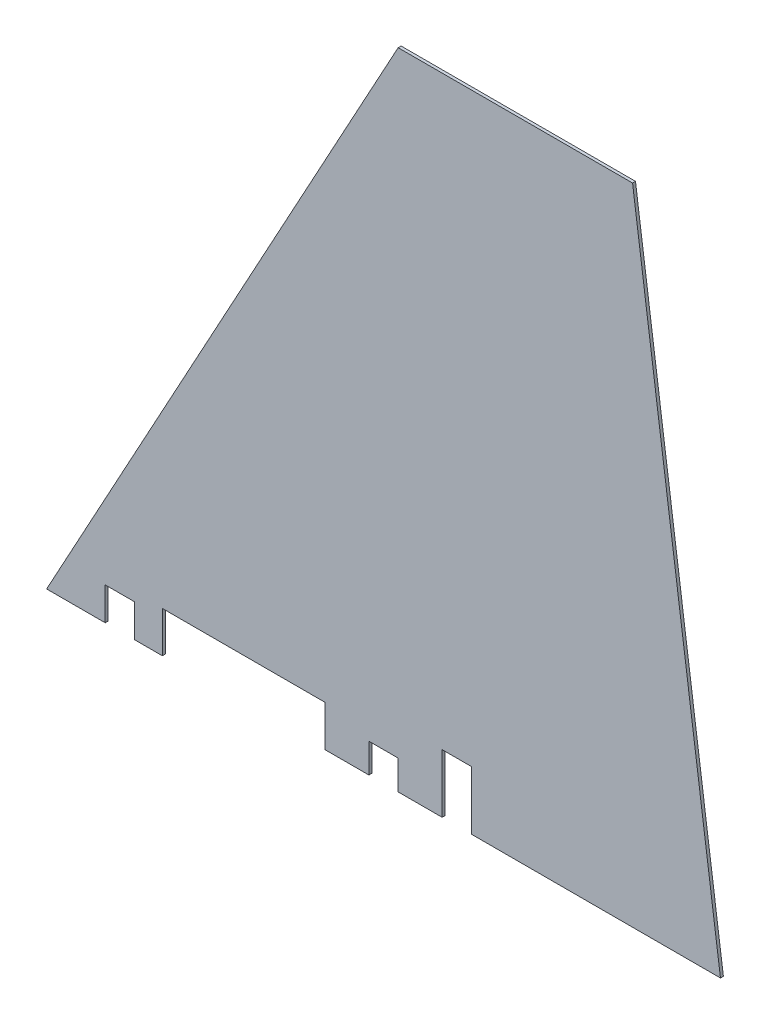
ISO-10303-21;
HEADER;
FILE_DESCRIPTION(('STEP AP214'),'2;1');
FILE_NAME('part.step','',(''),(''),'','','');
FILE_SCHEMA(('AUTOMOTIVE_DESIGN { 1 0 10303 214 1 1 1 1 }'));
ENDSEC;
DATA;
#1=APPLICATION_CONTEXT('core data for automotive mechanical design processes');
#2=APPLICATION_PROTOCOL_DEFINITION('international standard','automotive_design',2000,#1);
#3=PRODUCT_CONTEXT('',#1,'mechanical');
#4=PRODUCT('Part','Part','',(#3));
#5=PRODUCT_RELATED_PRODUCT_CATEGORY('part','',(#4));
#6=PRODUCT_DEFINITION_FORMATION('','',#4);
#7=PRODUCT_DEFINITION_CONTEXT('part definition',#1,'design');
#8=PRODUCT_DEFINITION('design','',#6,#7);
#9=PRODUCT_DEFINITION_SHAPE('','',#8);
#10=(LENGTH_UNIT() NAMED_UNIT(*) SI_UNIT(.MILLI.,.METRE.));
#11=(NAMED_UNIT(*) PLANE_ANGLE_UNIT() SI_UNIT($,.RADIAN.));
#12=(NAMED_UNIT(*) SI_UNIT($,.STERADIAN.) SOLID_ANGLE_UNIT());
#13=UNCERTAINTY_MEASURE_WITH_UNIT(LENGTH_MEASURE(1.E-05),#10,'distance_accuracy_value','');
#14=(GEOMETRIC_REPRESENTATION_CONTEXT(3) GLOBAL_UNCERTAINTY_ASSIGNED_CONTEXT((#13)) GLOBAL_UNIT_ASSIGNED_CONTEXT((#10,
#11,#12)) REPRESENTATION_CONTEXT('',''));
#15=CARTESIAN_POINT('',(0.,0.,0.));
#16=DIRECTION('',(0.,0.,1.));
#17=DIRECTION('',(1.,0.,0.));
#18=AXIS2_PLACEMENT_3D('',#15,#16,#17);
#19=CARTESIAN_POINT('',(-82.2853059546856,44.8828941571012,0.));
#20=DIRECTION('',(-0.877895572914385,0.478852130680573,0.));
#21=DIRECTION('',(-0.478852130680573,-0.877895572914385,0.));
#22=AXIS2_PLACEMENT_3D('',#19,#20,#21);
#23=PLANE('',#22);
#24=DIRECTION('',(0.,0.,-1.));
#25=VECTOR('',#24,1.);
#26=CARTESIAN_POINT('',(-150.323962146502,-79.8546421945616,0.));
#27=LINE('',#26,#25);
#28=CARTESIAN_POINT('',(-150.323962146502,-79.8546421945616,2.54));
#29=VERTEX_POINT('',#28);
#30=CARTESIAN_POINT('',(-150.323962146502,-79.8546421945616,0.));
#31=VERTEX_POINT('',#30);
#32=EDGE_CURVE('E11',#29,#31,#27,.T.);
#33=ORIENTED_EDGE('',*,*,#32,.F.);
#34=DIRECTION('',(-0.478852130680573,-0.877895572914385,0.));
#35=VECTOR('',#34,1.);
#36=CARTESIAN_POINT('',(-82.2853059546856,44.8828941571012,2.54));
#37=LINE('',#36,#35);
#38=CARTESIAN_POINT('',(154.476037853498,478.945357805438,2.54));
#39=VERTEX_POINT('',#38);
#40=EDGE_CURVE('E140',#39,#29,#37,.T.);
#41=ORIENTED_EDGE('',*,*,#40,.F.);
#42=DIRECTION('',(0.,0.,-1.));
#43=VECTOR('',#42,1.);
#44=CARTESIAN_POINT('',(154.476037853498,478.945357805438,0.));
#45=LINE('',#44,#43);
#46=CARTESIAN_POINT('',(154.476037853498,478.945357805438,0.));
#47=VERTEX_POINT('',#46);
#48=EDGE_CURVE('E46',#39,#47,#45,.T.);
#49=ORIENTED_EDGE('',*,*,#48,.T.);
#50=DIRECTION('',(-0.478852130680573,-0.877895572914385,0.));
#51=VECTOR('',#50,1.);
#52=CARTESIAN_POINT('',(-82.2853059546856,44.8828941571012,0.));
#53=LINE('',#52,#51);
#54=EDGE_CURVE('E251',#47,#31,#53,.T.);
#55=ORIENTED_EDGE('',*,*,#54,.T.);
#56=EDGE_LOOP('',(#33,#41,#49,#55));
#57=FACE_BOUND('',#56,.T.);
#58=ADVANCED_FACE('F37',(#57),#23,.T.);
#59=CARTESIAN_POINT('',(0.,478.945357805438,0.));
#60=DIRECTION('',(0.,-1.,0.));
#61=DIRECTION('',(1.,0.,0.));
#62=AXIS2_PLACEMENT_3D('',#59,#60,#61);
#63=PLANE('',#62);
#64=ORIENTED_EDGE('',*,*,#48,.F.);
#65=DIRECTION('',(1.,0.,0.));
#66=VECTOR('',#65,1.);
#67=CARTESIAN_POINT('',(0.,478.945357805438,2.54));
#68=LINE('',#67,#66);
#69=CARTESIAN_POINT('',(357.676037853498,478.945357805438,2.54));
#70=VERTEX_POINT('',#69);
#71=EDGE_CURVE('E195',#39,#70,#68,.T.);
#72=ORIENTED_EDGE('',*,*,#71,.T.);
#73=DIRECTION('',(0.,0.,-1.));
#74=VECTOR('',#73,1.);
#75=CARTESIAN_POINT('',(357.676037853498,478.945357805438,0.));
#76=LINE('',#75,#74);
#77=CARTESIAN_POINT('',(357.676037853498,478.945357805438,0.));
#78=VERTEX_POINT('',#77);
#79=EDGE_CURVE('E244',#70,#78,#76,.T.);
#80=ORIENTED_EDGE('',*,*,#79,.T.);
#81=DIRECTION('',(1.,0.,0.));
#82=VECTOR('',#81,1.);
#83=CARTESIAN_POINT('',(0.,478.945357805438,0.));
#84=LINE('',#83,#82);
#85=EDGE_CURVE('E260',#47,#78,#84,.T.);
#86=ORIENTED_EDGE('',*,*,#85,.F.);
#87=EDGE_LOOP('',(#64,#72,#80,#86));
#88=FACE_BOUND('',#87,.T.);
#89=ADVANCED_FACE('F263',(#88),#63,.F.);
#90=CARTESIAN_POINT('',(415.264900479213,56.6270318835292,0.));
#91=DIRECTION('',(-0.990830168044299,-0.135113204733314,0.));
#92=DIRECTION('',(0.135113204733314,-0.990830168044299,0.));
#93=AXIS2_PLACEMENT_3D('',#90,#91,#92);
#94=PLANE('',#93);
#95=ORIENTED_EDGE('',*,*,#79,.F.);
#96=DIRECTION('',(0.135113204733314,-0.990830168044299,0.));
#97=VECTOR('',#96,1.);
#98=CARTESIAN_POINT('',(415.264900479213,56.6270318835292,2.54));
#99=LINE('',#98,#97);
#100=CARTESIAN_POINT('',(433.876037853498,-79.8546421945616,2.54));
#101=VERTEX_POINT('',#100);
#102=EDGE_CURVE('E192',#70,#101,#99,.T.);
#103=ORIENTED_EDGE('',*,*,#102,.T.);
#104=DIRECTION('',(0.,0.,-1.));
#105=VECTOR('',#104,1.);
#106=CARTESIAN_POINT('',(433.876037853498,-79.8546421945616,0.));
#107=LINE('',#106,#105);
#108=CARTESIAN_POINT('',(433.876037853498,-79.8546421945616,0.));
#109=VERTEX_POINT('',#108);
#110=EDGE_CURVE('E241',#101,#109,#107,.T.);
#111=ORIENTED_EDGE('',*,*,#110,.T.);
#112=DIRECTION('',(0.135113204733314,-0.990830168044299,0.));
#113=VECTOR('',#112,1.);
#114=CARTESIAN_POINT('',(415.264900479213,56.6270318835292,0.));
#115=LINE('',#114,#113);
#116=EDGE_CURVE('E264',#78,#109,#115,.T.);
#117=ORIENTED_EDGE('',*,*,#116,.F.);
#118=EDGE_LOOP('',(#95,#103,#111,#117));
#119=FACE_BOUND('',#118,.T.);
#120=ADVANCED_FACE('F380',(#119),#94,.F.);
#121=CARTESIAN_POINT('',(0.,-79.8546421945616,0.));
#122=DIRECTION('',(0.,-1.,0.));
#123=DIRECTION('',(1.,0.,0.));
#124=AXIS2_PLACEMENT_3D('',#121,#122,#123);
#125=PLANE('',#124);
#126=ORIENTED_EDGE('',*,*,#110,.F.);
#127=DIRECTION('',(1.,0.,0.));
#128=VECTOR('',#127,1.);
#129=CARTESIAN_POINT('',(0.,-79.8546421945616,2.54));
#130=LINE('',#129,#128);
#131=CARTESIAN_POINT('',(217.976037853498,-79.8546421945616,2.54));
#132=VERTEX_POINT('',#131);
#133=EDGE_CURVE('E189',#132,#101,#130,.T.);
#134=ORIENTED_EDGE('',*,*,#133,.F.);
#135=DIRECTION('',(0.,0.,-1.));
#136=VECTOR('',#135,1.);
#137=CARTESIAN_POINT('',(217.976037853498,-79.8546421945616,0.));
#138=LINE('',#137,#136);
#139=CARTESIAN_POINT('',(217.976037853498,-79.8546421945616,0.));
#140=VERTEX_POINT('',#139);
#141=EDGE_CURVE('E238',#132,#140,#138,.T.);
#142=ORIENTED_EDGE('',*,*,#141,.T.);
#143=DIRECTION('',(1.,0.,0.));
#144=VECTOR('',#143,1.);
#145=CARTESIAN_POINT('',(0.,-79.8546421945616,0.));
#146=LINE('',#145,#144);
#147=EDGE_CURVE('E266',#140,#109,#146,.T.);
#148=ORIENTED_EDGE('',*,*,#147,.T.);
#149=EDGE_LOOP('',(#126,#134,#142,#148));
#150=FACE_BOUND('',#149,.T.);
#151=ADVANCED_FACE('F401',(#150),#125,.T.);
#152=CARTESIAN_POINT('',(217.976037853498,0.,0.));
#153=DIRECTION('',(1.,0.,0.));
#154=DIRECTION('',(0.,1.,0.));
#155=AXIS2_PLACEMENT_3D('',#152,#153,#154);
#156=PLANE('',#155);
#157=ORIENTED_EDGE('',*,*,#141,.F.);
#158=DIRECTION('',(0.,1.,0.));
#159=VECTOR('',#158,1.);
#160=CARTESIAN_POINT('',(217.976037853498,0.,2.54));
#161=LINE('',#160,#159);
#162=CARTESIAN_POINT('',(217.976037853498,-29.0546421945615,2.54));
#163=VERTEX_POINT('',#162);
#164=EDGE_CURVE('E186',#132,#163,#161,.T.);
#165=ORIENTED_EDGE('',*,*,#164,.T.);
#166=DIRECTION('',(0.,0.,-1.));
#167=VECTOR('',#166,1.);
#168=CARTESIAN_POINT('',(217.976037853498,-29.0546421945615,0.));
#169=LINE('',#168,#167);
#170=CARTESIAN_POINT('',(217.976037853498,-29.0546421945615,0.));
#171=VERTEX_POINT('',#170);
#172=EDGE_CURVE('E235',#163,#171,#169,.T.);
#173=ORIENTED_EDGE('',*,*,#172,.T.);
#174=DIRECTION('',(0.,1.,0.));
#175=VECTOR('',#174,1.);
#176=CARTESIAN_POINT('',(217.976037853498,0.,0.));
#177=LINE('',#176,#175);
#178=EDGE_CURVE('E270',#140,#171,#177,.T.);
#179=ORIENTED_EDGE('',*,*,#178,.F.);
#180=EDGE_LOOP('',(#157,#165,#173,#179));
#181=FACE_BOUND('',#180,.T.);
#182=ADVANCED_FACE('F386',(#181),#156,.F.);
#183=CARTESIAN_POINT('',(0.,-29.0546421945615,0.));
#184=DIRECTION('',(0.,1.,0.));
#185=DIRECTION('',(-1.,0.,0.));
#186=AXIS2_PLACEMENT_3D('',#183,#184,#185);
#187=PLANE('',#186);
#188=ORIENTED_EDGE('',*,*,#172,.F.);
#189=DIRECTION('',(1.,0.,0.));
#190=VECTOR('',#189,1.);
#191=CARTESIAN_POINT('',(0.,-29.0546421945615,2.54));
#192=LINE('',#191,#190);
#193=CARTESIAN_POINT('',(192.576037853498,-29.0546421945615,2.54));
#194=VERTEX_POINT('',#193);
#195=EDGE_CURVE('E183',#163,#194,#192,.F.);
#196=ORIENTED_EDGE('',*,*,#195,.T.);
#197=DIRECTION('',(0.,0.,-1.));
#198=VECTOR('',#197,1.);
#199=CARTESIAN_POINT('',(192.576037853498,-29.0546421945615,0.));
#200=LINE('',#199,#198);
#201=CARTESIAN_POINT('',(192.576037853498,-29.0546421945615,0.));
#202=VERTEX_POINT('',#201);
#203=EDGE_CURVE('E232',#194,#202,#200,.T.);
#204=ORIENTED_EDGE('',*,*,#203,.T.);
#205=DIRECTION('',(-1.,0.,0.));
#206=VECTOR('',#205,1.);
#207=CARTESIAN_POINT('',(0.,-29.0546421945615,0.));
#208=LINE('',#207,#206);
#209=EDGE_CURVE('E273',#171,#202,#208,.T.);
#210=ORIENTED_EDGE('',*,*,#209,.F.);
#211=EDGE_LOOP('',(#188,#196,#204,#210));
#212=FACE_BOUND('',#211,.T.);
#213=ADVANCED_FACE('F390',(#212),#187,.F.);
#214=CARTESIAN_POINT('',(192.576037853498,-1.05217692527578E-13,0.));
#215=DIRECTION('',(-1.,0.,0.));
#216=DIRECTION('',(0.,-1.,0.));
#217=AXIS2_PLACEMENT_3D('',#214,#215,#216);
#218=PLANE('',#217);
#219=ORIENTED_EDGE('',*,*,#203,.F.);
#220=DIRECTION('',(0.,1.,0.));
#221=VECTOR('',#220,1.);
#222=CARTESIAN_POINT('',(192.576037853498,0.,2.54));
#223=LINE('',#222,#221);
#224=CARTESIAN_POINT('',(192.576037853498,-79.8546421945616,2.54));
#225=VERTEX_POINT('',#224);
#226=EDGE_CURVE('E180',#194,#225,#223,.F.);
#227=ORIENTED_EDGE('',*,*,#226,.T.);
#228=DIRECTION('',(0.,0.,-1.));
#229=VECTOR('',#228,1.);
#230=CARTESIAN_POINT('',(192.576037853498,-79.8546421945616,0.));
#231=LINE('',#230,#229);
#232=CARTESIAN_POINT('',(192.576037853498,-79.8546421945616,0.));
#233=VERTEX_POINT('',#232);
#234=EDGE_CURVE('E229',#225,#233,#231,.T.);
#235=ORIENTED_EDGE('',*,*,#234,.T.);
#236=DIRECTION('',(0.,-1.,0.));
#237=VECTOR('',#236,1.);
#238=CARTESIAN_POINT('',(192.576037853498,-1.05217692527578E-13,0.));
#239=LINE('',#238,#237);
#240=EDGE_CURVE('E276',#202,#233,#239,.T.);
#241=ORIENTED_EDGE('',*,*,#240,.F.);
#242=EDGE_LOOP('',(#219,#227,#235,#241));
#243=FACE_BOUND('',#242,.T.);
#244=ADVANCED_FACE('F393',(#243),#218,.F.);
#245=ORIENTED_EDGE('',*,*,#234,.F.);
#246=DIRECTION('',(1.,0.,0.));
#247=VECTOR('',#246,1.);
#248=CARTESIAN_POINT('',(0.,-79.8546421945616,2.54));
#249=LINE('',#248,#247);
#250=CARTESIAN_POINT('',(154.476037853498,-79.8546421945616,2.54));
#251=VERTEX_POINT('',#250);
#252=EDGE_CURVE('E177',#251,#225,#249,.T.);
#253=ORIENTED_EDGE('',*,*,#252,.F.);
#254=DIRECTION('',(0.,0.,-1.));
#255=VECTOR('',#254,1.);
#256=CARTESIAN_POINT('',(154.476037853498,-79.8546421945616,0.));
#257=LINE('',#256,#255);
#258=CARTESIAN_POINT('',(154.476037853498,-79.8546421945616,0.));
#259=VERTEX_POINT('',#258);
#260=EDGE_CURVE('E226',#251,#259,#257,.T.);
#261=ORIENTED_EDGE('',*,*,#260,.T.);
#262=EDGE_CURVE('E279',#259,#233,#146,.T.);
#263=ORIENTED_EDGE('',*,*,#262,.T.);
#264=EDGE_LOOP('',(#245,#253,#261,#263));
#265=FACE_BOUND('',#264,.T.);
#266=ADVANCED_FACE('F317',(#265),#125,.T.);
#267=CARTESIAN_POINT('',(154.476037853498,0.,0.));
#268=DIRECTION('',(1.,0.,0.));
#269=DIRECTION('',(0.,1.,0.));
#270=AXIS2_PLACEMENT_3D('',#267,#268,#269);
#271=PLANE('',#270);
#272=ORIENTED_EDGE('',*,*,#260,.F.);
#273=DIRECTION('',(0.,1.,0.));
#274=VECTOR('',#273,1.);
#275=CARTESIAN_POINT('',(154.476037853498,0.,2.54));
#276=LINE('',#275,#274);
#277=CARTESIAN_POINT('',(154.476037853498,-54.4546421945616,2.54));
#278=VERTEX_POINT('',#277);
#279=EDGE_CURVE('E174',#251,#278,#276,.T.);
#280=ORIENTED_EDGE('',*,*,#279,.T.);
#281=DIRECTION('',(0.,0.,-1.));
#282=VECTOR('',#281,1.);
#283=CARTESIAN_POINT('',(154.476037853498,-54.4546421945616,0.));
#284=LINE('',#283,#282);
#285=CARTESIAN_POINT('',(154.476037853498,-54.4546421945616,0.));
#286=VERTEX_POINT('',#285);
#287=EDGE_CURVE('E223',#278,#286,#284,.T.);
#288=ORIENTED_EDGE('',*,*,#287,.T.);
#289=DIRECTION('',(0.,1.,0.));
#290=VECTOR('',#289,1.);
#291=CARTESIAN_POINT('',(154.476037853498,0.,0.));
#292=LINE('',#291,#290);
#293=EDGE_CURVE('E280',#259,#286,#292,.T.);
#294=ORIENTED_EDGE('',*,*,#293,.F.);
#295=EDGE_LOOP('',(#272,#280,#288,#294));
#296=FACE_BOUND('',#295,.T.);
#297=ADVANCED_FACE('F328',(#296),#271,.F.);
#298=CARTESIAN_POINT('',(0.,-54.4546421945616,0.));
#299=DIRECTION('',(0.,1.,0.));
#300=DIRECTION('',(-1.,0.,0.));
#301=AXIS2_PLACEMENT_3D('',#298,#299,#300);
#302=PLANE('',#301);
#303=ORIENTED_EDGE('',*,*,#287,.F.);
#304=DIRECTION('',(1.,0.,0.));
#305=VECTOR('',#304,1.);
#306=CARTESIAN_POINT('',(0.,-54.4546421945616,2.54));
#307=LINE('',#306,#305);
#308=CARTESIAN_POINT('',(129.076037853498,-54.4546421945616,2.54));
#309=VERTEX_POINT('',#308);
#310=EDGE_CURVE('E171',#278,#309,#307,.F.);
#311=ORIENTED_EDGE('',*,*,#310,.T.);
#312=DIRECTION('',(0.,0.,-1.));
#313=VECTOR('',#312,1.);
#314=CARTESIAN_POINT('',(129.076037853498,-54.4546421945616,0.));
#315=LINE('',#314,#313);
#316=CARTESIAN_POINT('',(129.076037853498,-54.4546421945616,0.));
#317=VERTEX_POINT('',#316);
#318=EDGE_CURVE('E220',#309,#317,#315,.T.);
#319=ORIENTED_EDGE('',*,*,#318,.T.);
#320=DIRECTION('',(-1.,0.,0.));
#321=VECTOR('',#320,1.);
#322=CARTESIAN_POINT('',(0.,-54.4546421945616,0.));
#323=LINE('',#322,#321);
#324=EDGE_CURVE('E283',#286,#317,#323,.T.);
#325=ORIENTED_EDGE('',*,*,#324,.F.);
#326=EDGE_LOOP('',(#303,#311,#319,#325));
#327=FACE_BOUND('',#326,.T.);
#328=ADVANCED_FACE('F334',(#327),#302,.F.);
#329=CARTESIAN_POINT('',(129.076037853498,1.41046446016084E-13,0.));
#330=DIRECTION('',(-1.,0.,0.));
#331=DIRECTION('',(0.,-1.,0.));
#332=AXIS2_PLACEMENT_3D('',#329,#330,#331);
#333=PLANE('',#332);
#334=ORIENTED_EDGE('',*,*,#318,.F.);
#335=DIRECTION('',(0.,1.,0.));
#336=VECTOR('',#335,1.);
#337=CARTESIAN_POINT('',(129.076037853498,0.,2.54));
#338=LINE('',#337,#336);
#339=CARTESIAN_POINT('',(129.076037853498,-79.8546421945616,2.54));
#340=VERTEX_POINT('',#339);
#341=EDGE_CURVE('E168',#309,#340,#338,.F.);
#342=ORIENTED_EDGE('',*,*,#341,.T.);
#343=DIRECTION('',(0.,0.,-1.));
#344=VECTOR('',#343,1.);
#345=CARTESIAN_POINT('',(129.076037853498,-79.8546421945616,0.));
#346=LINE('',#345,#344);
#347=CARTESIAN_POINT('',(129.076037853498,-79.8546421945616,0.));
#348=VERTEX_POINT('',#347);
#349=EDGE_CURVE('E217',#340,#348,#346,.T.);
#350=ORIENTED_EDGE('',*,*,#349,.T.);
#351=DIRECTION('',(0.,-1.,0.));
#352=VECTOR('',#351,1.);
#353=CARTESIAN_POINT('',(129.076037853498,1.41046446016084E-13,0.));
#354=LINE('',#353,#352);
#355=EDGE_CURVE('E286',#317,#348,#354,.T.);
#356=ORIENTED_EDGE('',*,*,#355,.F.);
#357=EDGE_LOOP('',(#334,#342,#350,#356));
#358=FACE_BOUND('',#357,.T.);
#359=ADVANCED_FACE('F339',(#358),#333,.F.);
#360=ORIENTED_EDGE('',*,*,#349,.F.);
#361=DIRECTION('',(1.,0.,0.));
#362=VECTOR('',#361,1.);
#363=CARTESIAN_POINT('',(0.,-79.8546421945616,2.54));
#364=LINE('',#363,#362);
#365=CARTESIAN_POINT('',(90.9760378534982,-79.8546421945616,2.54));
#366=VERTEX_POINT('',#365);
#367=EDGE_CURVE('E165',#366,#340,#364,.T.);
#368=ORIENTED_EDGE('',*,*,#367,.F.);
#369=DIRECTION('',(0.,0.,-1.));
#370=VECTOR('',#369,1.);
#371=CARTESIAN_POINT('',(90.9760378534982,-79.8546421945616,0.));
#372=LINE('',#371,#370);
#373=CARTESIAN_POINT('',(90.9760378534982,-79.8546421945616,0.));
#374=VERTEX_POINT('',#373);
#375=EDGE_CURVE('E214',#366,#374,#372,.T.);
#376=ORIENTED_EDGE('',*,*,#375,.T.);
#377=EDGE_CURVE('E289',#374,#348,#146,.T.);
#378=ORIENTED_EDGE('',*,*,#377,.T.);
#379=EDGE_LOOP('',(#360,#368,#376,#378));
#380=FACE_BOUND('',#379,.T.);
#381=ADVANCED_FACE('F348',(#380),#125,.T.);
#382=CARTESIAN_POINT('',(90.9760378534982,0.,0.));
#383=DIRECTION('',(1.,0.,0.));
#384=DIRECTION('',(0.,1.,0.));
#385=AXIS2_PLACEMENT_3D('',#382,#383,#384);
#386=PLANE('',#385);
#387=ORIENTED_EDGE('',*,*,#375,.F.);
#388=DIRECTION('',(0.,1.,0.));
#389=VECTOR('',#388,1.);
#390=CARTESIAN_POINT('',(90.9760378534982,0.,2.54));
#391=LINE('',#390,#389);
#392=CARTESIAN_POINT('',(90.9760378534982,-44.2946421945616,2.54));
#393=VERTEX_POINT('',#392);
#394=EDGE_CURVE('E162',#366,#393,#391,.T.);
#395=ORIENTED_EDGE('',*,*,#394,.T.);
#396=DIRECTION('',(0.,0.,-1.));
#397=VECTOR('',#396,1.);
#398=CARTESIAN_POINT('',(90.9760378534982,-44.2946421945616,0.));
#399=LINE('',#398,#397);
#400=CARTESIAN_POINT('',(90.9760378534982,-44.2946421945616,0.));
#401=VERTEX_POINT('',#400);
#402=EDGE_CURVE('E211',#393,#401,#399,.T.);
#403=ORIENTED_EDGE('',*,*,#402,.T.);
#404=DIRECTION('',(0.,1.,0.));
#405=VECTOR('',#404,1.);
#406=CARTESIAN_POINT('',(90.9760378534982,0.,0.));
#407=LINE('',#406,#405);
#408=EDGE_CURVE('E290',#374,#401,#407,.T.);
#409=ORIENTED_EDGE('',*,*,#408,.F.);
#410=EDGE_LOOP('',(#387,#395,#403,#409));
#411=FACE_BOUND('',#410,.T.);
#412=ADVANCED_FACE('F352',(#411),#386,.F.);
#413=CARTESIAN_POINT('',(0.,-44.2946421945616,0.));
#414=DIRECTION('',(0.,1.,0.));
#415=DIRECTION('',(-1.,0.,0.));
#416=AXIS2_PLACEMENT_3D('',#413,#414,#415);
#417=PLANE('',#416);
#418=ORIENTED_EDGE('',*,*,#402,.F.);
#419=DIRECTION('',(1.,0.,0.));
#420=VECTOR('',#419,1.);
#421=CARTESIAN_POINT('',(0.,-44.2946421945616,2.54));
#422=LINE('',#421,#420);
#423=CARTESIAN_POINT('',(-49.9939621465018,-44.2946421945616,2.54));
#424=VERTEX_POINT('',#423);
#425=EDGE_CURVE('E159',#393,#424,#422,.F.);
#426=ORIENTED_EDGE('',*,*,#425,.T.);
#427=DIRECTION('',(0.,0.,-1.));
#428=VECTOR('',#427,1.);
#429=CARTESIAN_POINT('',(-49.9939621465018,-44.2946421945616,0.));
#430=LINE('',#429,#428);
#431=CARTESIAN_POINT('',(-49.9939621465018,-44.2946421945616,0.));
#432=VERTEX_POINT('',#431);
#433=EDGE_CURVE('E208',#424,#432,#430,.T.);
#434=ORIENTED_EDGE('',*,*,#433,.T.);
#435=DIRECTION('',(-1.,0.,0.));
#436=VECTOR('',#435,1.);
#437=CARTESIAN_POINT('',(0.,-44.2946421945616,0.));
#438=LINE('',#437,#436);
#439=EDGE_CURVE('E293',#401,#432,#438,.T.);
#440=ORIENTED_EDGE('',*,*,#439,.F.);
#441=EDGE_LOOP('',(#418,#426,#434,#440));
#442=FACE_BOUND('',#441,.T.);
#443=ADVANCED_FACE('F356',(#442),#417,.F.);
#444=CARTESIAN_POINT('',(-49.9939621465018,0.,0.));
#445=DIRECTION('',(-1.,0.,0.));
#446=DIRECTION('',(0.,-1.,0.));
#447=AXIS2_PLACEMENT_3D('',#444,#445,#446);
#448=PLANE('',#447);
#449=ORIENTED_EDGE('',*,*,#433,.F.);
#450=DIRECTION('',(0.,1.,0.));
#451=VECTOR('',#450,1.);
#452=CARTESIAN_POINT('',(-49.9939621465018,0.,2.54));
#453=LINE('',#452,#451);
#454=CARTESIAN_POINT('',(-49.9939621465018,-79.8546421945616,2.54));
#455=VERTEX_POINT('',#454);
#456=EDGE_CURVE('E156',#424,#455,#453,.F.);
#457=ORIENTED_EDGE('',*,*,#456,.T.);
#458=DIRECTION('',(0.,0.,-1.));
#459=VECTOR('',#458,1.);
#460=CARTESIAN_POINT('',(-49.9939621465018,-79.8546421945616,0.));
#461=LINE('',#460,#459);
#462=CARTESIAN_POINT('',(-49.9939621465018,-79.8546421945616,0.));
#463=VERTEX_POINT('',#462);
#464=EDGE_CURVE('E205',#455,#463,#461,.T.);
#465=ORIENTED_EDGE('',*,*,#464,.T.);
#466=DIRECTION('',(0.,-1.,0.));
#467=VECTOR('',#466,1.);
#468=CARTESIAN_POINT('',(-49.9939621465018,0.,0.));
#469=LINE('',#468,#467);
#470=EDGE_CURVE('E296',#432,#463,#469,.T.);
#471=ORIENTED_EDGE('',*,*,#470,.F.);
#472=EDGE_LOOP('',(#449,#457,#465,#471));
#473=FACE_BOUND('',#472,.T.);
#474=ADVANCED_FACE('F363',(#473),#448,.F.);
#475=ORIENTED_EDGE('',*,*,#464,.F.);
#476=DIRECTION('',(1.,0.,0.));
#477=VECTOR('',#476,1.);
#478=CARTESIAN_POINT('',(0.,-79.8546421945616,2.54));
#479=LINE('',#478,#477);
#480=CARTESIAN_POINT('',(-74.1239621465018,-79.8546421945616,2.54));
#481=VERTEX_POINT('',#480);
#482=EDGE_CURVE('E153',#481,#455,#479,.T.);
#483=ORIENTED_EDGE('',*,*,#482,.F.);
#484=DIRECTION('',(0.,0.,-1.));
#485=VECTOR('',#484,1.);
#486=CARTESIAN_POINT('',(-74.1239621465018,-79.8546421945616,0.));
#487=LINE('',#486,#485);
#488=CARTESIAN_POINT('',(-74.1239621465018,-79.8546421945616,0.));
#489=VERTEX_POINT('',#488);
#490=EDGE_CURVE('E202',#481,#489,#487,.T.);
#491=ORIENTED_EDGE('',*,*,#490,.T.);
#492=EDGE_CURVE('E298',#489,#463,#146,.T.);
#493=ORIENTED_EDGE('',*,*,#492,.T.);
#494=EDGE_LOOP('',(#475,#483,#491,#493));
#495=FACE_BOUND('',#494,.T.);
#496=ADVANCED_FACE('F366',(#495),#125,.T.);
#497=CARTESIAN_POINT('',(-74.1239621465018,0.,0.));
#498=DIRECTION('',(1.,0.,0.));
#499=DIRECTION('',(0.,1.,0.));
#500=AXIS2_PLACEMENT_3D('',#497,#498,#499);
#501=PLANE('',#500);
#502=ORIENTED_EDGE('',*,*,#490,.F.);
#503=DIRECTION('',(0.,1.,0.));
#504=VECTOR('',#503,1.);
#505=CARTESIAN_POINT('',(-74.1239621465018,0.,2.54));
#506=LINE('',#505,#504);
#507=CARTESIAN_POINT('',(-74.1239621465018,-51.3791530944628,2.54));
#508=VERTEX_POINT('',#507);
#509=EDGE_CURVE('E150',#481,#508,#506,.T.);
#510=ORIENTED_EDGE('',*,*,#509,.T.);
#511=DIRECTION('',(0.,0.,-1.));
#512=VECTOR('',#511,1.);
#513=CARTESIAN_POINT('',(-74.1239621465018,-51.3791530944628,0.));
#514=LINE('',#513,#512);
#515=CARTESIAN_POINT('',(-74.1239621465018,-51.3791530944628,0.));
#516=VERTEX_POINT('',#515);
#517=EDGE_CURVE('E200',#508,#516,#514,.T.);
#518=ORIENTED_EDGE('',*,*,#517,.T.);
#519=DIRECTION('',(0.,1.,0.));
#520=VECTOR('',#519,1.);
#521=CARTESIAN_POINT('',(-74.1239621465018,0.,0.));
#522=LINE('',#521,#520);
#523=EDGE_CURVE('E299',#489,#516,#522,.T.);
#524=ORIENTED_EDGE('',*,*,#523,.F.);
#525=EDGE_LOOP('',(#502,#510,#518,#524));
#526=FACE_BOUND('',#525,.T.);
#527=ADVANCED_FACE('F369',(#526),#501,.F.);
#528=CARTESIAN_POINT('',(0.,-51.3791530944628,0.));
#529=DIRECTION('',(0.,1.,0.));
#530=DIRECTION('',(-1.,0.,0.));
#531=AXIS2_PLACEMENT_3D('',#528,#529,#530);
#532=PLANE('',#531);
#533=ORIENTED_EDGE('',*,*,#517,.F.);
#534=DIRECTION('',(1.,0.,0.));
#535=VECTOR('',#534,1.);
#536=CARTESIAN_POINT('',(0.,-51.3791530944628,2.54));
#537=LINE('',#536,#535);
#538=CARTESIAN_POINT('',(-99.5239621465018,-51.3791530944627,2.54));
#539=VERTEX_POINT('',#538);
#540=EDGE_CURVE('E147',#508,#539,#537,.F.);
#541=ORIENTED_EDGE('',*,*,#540,.T.);
#542=DIRECTION('',(0.,0.,-1.));
#543=VECTOR('',#542,1.);
#544=CARTESIAN_POINT('',(-99.5239621465018,-51.3791530944627,0.));
#545=LINE('',#544,#543);
#546=CARTESIAN_POINT('',(-99.5239621465018,-51.3791530944627,0.));
#547=VERTEX_POINT('',#546);
#548=EDGE_CURVE('E54',#539,#547,#545,.T.);
#549=ORIENTED_EDGE('',*,*,#548,.T.);
#550=DIRECTION('',(-1.,0.,0.));
#551=VECTOR('',#550,1.);
#552=CARTESIAN_POINT('',(0.,-51.3791530944628,0.));
#553=LINE('',#552,#551);
#554=EDGE_CURVE('E133',#516,#547,#553,.T.);
#555=ORIENTED_EDGE('',*,*,#554,.F.);
#556=EDGE_LOOP('',(#533,#541,#549,#555));
#557=FACE_BOUND('',#556,.T.);
#558=ADVANCED_FACE('F428',(#557),#532,.F.);
#559=CARTESIAN_POINT('',(-99.5239621465018,0.,0.));
#560=DIRECTION('',(-1.,0.,0.));
#561=DIRECTION('',(0.,-1.,0.));
#562=AXIS2_PLACEMENT_3D('',#559,#560,#561);
#563=PLANE('',#562);
#564=ORIENTED_EDGE('',*,*,#548,.F.);
#565=DIRECTION('',(0.,1.,0.));
#566=VECTOR('',#565,1.);
#567=CARTESIAN_POINT('',(-99.5239621465018,0.,2.54));
#568=LINE('',#567,#566);
#569=CARTESIAN_POINT('',(-99.5239621465018,-79.8546421945616,2.54));
#570=VERTEX_POINT('',#569);
#571=EDGE_CURVE('E138',#539,#570,#568,.F.);
#572=ORIENTED_EDGE('',*,*,#571,.T.);
#573=DIRECTION('',(0.,0.,-1.));
#574=VECTOR('',#573,1.);
#575=CARTESIAN_POINT('',(-99.5239621465018,-79.8546421945616,0.));
#576=LINE('',#575,#574);
#577=CARTESIAN_POINT('',(-99.5239621465018,-79.8546421945616,0.));
#578=VERTEX_POINT('',#577);
#579=EDGE_CURVE('E40',#570,#578,#576,.T.);
#580=ORIENTED_EDGE('',*,*,#579,.T.);
#581=DIRECTION('',(0.,-1.,0.));
#582=VECTOR('',#581,1.);
#583=CARTESIAN_POINT('',(-99.5239621465018,0.,0.));
#584=LINE('',#583,#582);
#585=EDGE_CURVE('E149',#547,#578,#584,.T.);
#586=ORIENTED_EDGE('',*,*,#585,.F.);
#587=EDGE_LOOP('',(#564,#572,#580,#586));
#588=FACE_BOUND('',#587,.T.);
#589=ADVANCED_FACE('F142',(#588),#563,.F.);
#590=DIRECTION('',(1.,0.,0.));
#591=VECTOR('',#590,1.);
#592=CARTESIAN_POINT('',(0.,-79.8546421945616,2.54));
#593=LINE('',#592,#591);
#594=EDGE_CURVE('E127',#29,#570,#593,.T.);
#595=ORIENTED_EDGE('',*,*,#594,.F.);
#596=ORIENTED_EDGE('',*,*,#32,.T.);
#597=EDGE_CURVE('E129',#31,#578,#146,.T.);
#598=ORIENTED_EDGE('',*,*,#597,.T.);
#599=ORIENTED_EDGE('',*,*,#579,.F.);
#600=EDGE_LOOP('',(#595,#596,#598,#599));
#601=FACE_BOUND('',#600,.T.);
#602=ADVANCED_FACE('F126',(#601),#125,.T.);
#603=CARTESIAN_POINT('',(0.,0.,0.));
#604=DIRECTION('',(0.,0.,1.));
#605=DIRECTION('',(1.,0.,0.));
#606=AXIS2_PLACEMENT_3D('',#603,#604,#605);
#607=PLANE('',#606);
#608=ORIENTED_EDGE('',*,*,#585,.T.);
#609=ORIENTED_EDGE('',*,*,#597,.F.);
#610=ORIENTED_EDGE('',*,*,#54,.F.);
#611=ORIENTED_EDGE('',*,*,#85,.T.);
#612=ORIENTED_EDGE('',*,*,#116,.T.);
#613=ORIENTED_EDGE('',*,*,#147,.F.);
#614=ORIENTED_EDGE('',*,*,#178,.T.);
#615=ORIENTED_EDGE('',*,*,#209,.T.);
#616=ORIENTED_EDGE('',*,*,#240,.T.);
#617=ORIENTED_EDGE('',*,*,#262,.F.);
#618=ORIENTED_EDGE('',*,*,#293,.T.);
#619=ORIENTED_EDGE('',*,*,#324,.T.);
#620=ORIENTED_EDGE('',*,*,#355,.T.);
#621=ORIENTED_EDGE('',*,*,#377,.F.);
#622=ORIENTED_EDGE('',*,*,#408,.T.);
#623=ORIENTED_EDGE('',*,*,#439,.T.);
#624=ORIENTED_EDGE('',*,*,#470,.T.);
#625=ORIENTED_EDGE('',*,*,#492,.F.);
#626=ORIENTED_EDGE('',*,*,#523,.T.);
#627=ORIENTED_EDGE('',*,*,#554,.T.);
#628=EDGE_LOOP('',(#608,#609,#610,#611,#612,#613,#614,#615,#616,#617,#618,#619,#620,#621,#622,
#623,#624,#625,#626,#627));
#629=FACE_BOUND('',#628,.T.);
#630=ADVANCED_FACE('F258',(#629),#607,.F.);
#631=CARTESIAN_POINT('',(0.,0.,2.54));
#632=DIRECTION('',(0.,0.,1.));
#633=DIRECTION('',(1.,0.,0.));
#634=AXIS2_PLACEMENT_3D('',#631,#632,#633);
#635=PLANE('',#634);
#636=ORIENTED_EDGE('',*,*,#571,.F.);
#637=ORIENTED_EDGE('',*,*,#540,.F.);
#638=ORIENTED_EDGE('',*,*,#509,.F.);
#639=ORIENTED_EDGE('',*,*,#482,.T.);
#640=ORIENTED_EDGE('',*,*,#456,.F.);
#641=ORIENTED_EDGE('',*,*,#425,.F.);
#642=ORIENTED_EDGE('',*,*,#394,.F.);
#643=ORIENTED_EDGE('',*,*,#367,.T.);
#644=ORIENTED_EDGE('',*,*,#341,.F.);
#645=ORIENTED_EDGE('',*,*,#310,.F.);
#646=ORIENTED_EDGE('',*,*,#279,.F.);
#647=ORIENTED_EDGE('',*,*,#252,.T.);
#648=ORIENTED_EDGE('',*,*,#226,.F.);
#649=ORIENTED_EDGE('',*,*,#195,.F.);
#650=ORIENTED_EDGE('',*,*,#164,.F.);
#651=ORIENTED_EDGE('',*,*,#133,.T.);
#652=ORIENTED_EDGE('',*,*,#102,.F.);
#653=ORIENTED_EDGE('',*,*,#71,.F.);
#654=ORIENTED_EDGE('',*,*,#40,.T.);
#655=ORIENTED_EDGE('',*,*,#594,.T.);
#656=EDGE_LOOP('',(#636,#637,#638,#639,#640,#641,#642,#643,#644,#645,#646,#647,#648,#649,#650,
#651,#652,#653,#654,#655));
#657=FACE_BOUND('',#656,.T.);
#658=ADVANCED_FACE('F136',(#657),#635,.T.);
#659=CLOSED_SHELL('',(#58,#89,#120,#151,#182,#213,#244,#266,#297,#328,#359,#381,#412,#443,#474,
#496,#527,#558,#589,#602,#630,#658));
#660=MANIFOLD_SOLID_BREP('B2',#659);
#661=ADVANCED_BREP_SHAPE_REPRESENTATION('',(#18,#660),#14);
#662=SHAPE_DEFINITION_REPRESENTATION(#9,#661);
ENDSEC;
END-ISO-10303-21;
